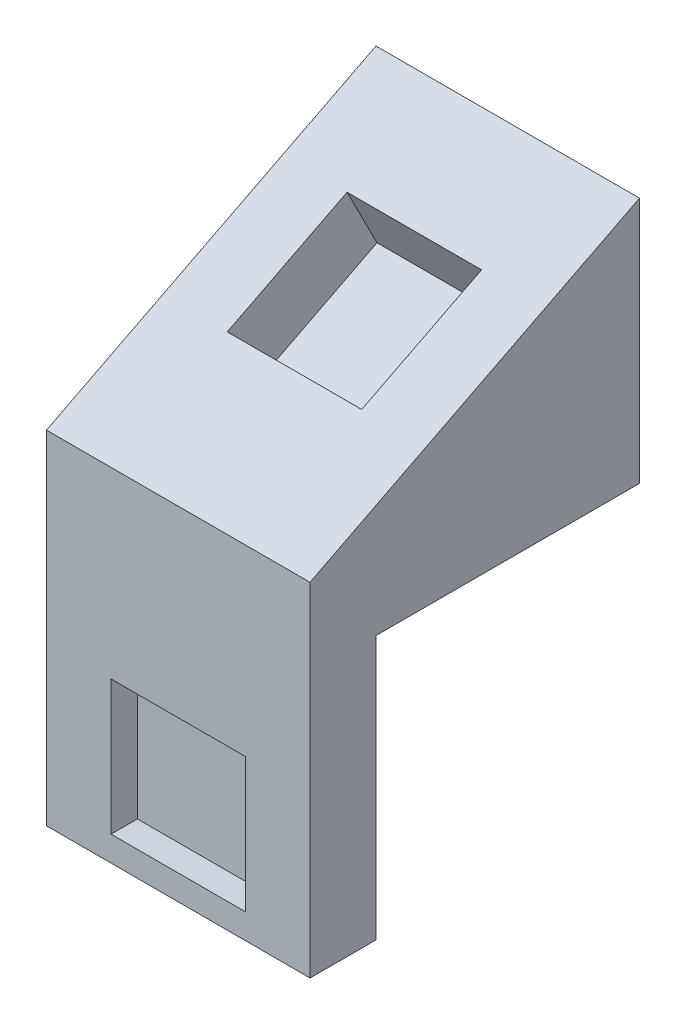
ISO-10303-21;
HEADER;
FILE_DESCRIPTION(('STEP AP214'),'2;1');
FILE_NAME('part.step','',(''),(''),'','','');
FILE_SCHEMA(('AUTOMOTIVE_DESIGN { 1 0 10303 214 1 1 1 1 }'));
ENDSEC;
DATA;
#1=APPLICATION_CONTEXT('core data for automotive mechanical design processes');
#2=APPLICATION_PROTOCOL_DEFINITION('international standard','automotive_design',2000,#1);
#3=PRODUCT_CONTEXT('',#1,'mechanical');
#4=PRODUCT('Part','Part','',(#3));
#5=PRODUCT_RELATED_PRODUCT_CATEGORY('part','',(#4));
#6=PRODUCT_DEFINITION_FORMATION('','',#4);
#7=PRODUCT_DEFINITION_CONTEXT('part definition',#1,'design');
#8=PRODUCT_DEFINITION('design','',#6,#7);
#9=PRODUCT_DEFINITION_SHAPE('','',#8);
#10=(LENGTH_UNIT() NAMED_UNIT(*) SI_UNIT(.MILLI.,.METRE.));
#11=(NAMED_UNIT(*) PLANE_ANGLE_UNIT() SI_UNIT($,.RADIAN.));
#12=(NAMED_UNIT(*) SI_UNIT($,.STERADIAN.) SOLID_ANGLE_UNIT());
#13=UNCERTAINTY_MEASURE_WITH_UNIT(LENGTH_MEASURE(1.E-05),#10,'distance_accuracy_value','');
#14=(GEOMETRIC_REPRESENTATION_CONTEXT(3) GLOBAL_UNCERTAINTY_ASSIGNED_CONTEXT((#13)) GLOBAL_UNIT_ASSIGNED_CONTEXT((#10,
#11,#12)) REPRESENTATION_CONTEXT('',''));
#15=CARTESIAN_POINT('',(0.,0.,0.));
#16=DIRECTION('',(0.,0.,1.));
#17=DIRECTION('',(1.,0.,0.));
#18=AXIS2_PLACEMENT_3D('',#15,#16,#17);
#19=CARTESIAN_POINT('',(10.,-13.,5.));
#20=DIRECTION('',(-1.,0.,0.));
#21=DIRECTION('',(0.,-1.,0.));
#22=AXIS2_PLACEMENT_3D('',#19,#20,#21);
#23=PLANE('',#22);
#24=DIRECTION('',(0.,1.,0.));
#25=VECTOR('',#24,1.);
#26=CARTESIAN_POINT('',(10.,-13.,0.));
#27=LINE('',#26,#25);
#28=CARTESIAN_POINT('',(10.,-13.,0.));
#29=VERTEX_POINT('',#28);
#30=CARTESIAN_POINT('',(10.,7.,0.));
#31=VERTEX_POINT('',#30);
#32=EDGE_CURVE('E238',#29,#31,#27,.T.);
#33=ORIENTED_EDGE('',*,*,#32,.T.);
#34=DIRECTION('',(0.,0.,1.));
#35=VECTOR('',#34,1.);
#36=CARTESIAN_POINT('',(10.,7.,-20.));
#37=LINE('',#36,#35);
#38=CARTESIAN_POINT('',(10.,7.,-20.));
#39=VERTEX_POINT('',#38);
#40=EDGE_CURVE('E235',#39,#31,#37,.T.);
#41=ORIENTED_EDGE('',*,*,#40,.F.);
#42=DIRECTION('',(0.,-1.,0.));
#43=VECTOR('',#42,1.);
#44=CARTESIAN_POINT('',(10.,13.,-20.));
#45=LINE('',#44,#43);
#46=CARTESIAN_POINT('',(10.,25.7381362373605,-20.));
#47=VERTEX_POINT('',#46);
#48=EDGE_CURVE('E226',#47,#39,#45,.T.);
#49=ORIENTED_EDGE('',*,*,#48,.F.);
#50=DIRECTION('',(0.,-0.453990499739542,0.89100652418837));
#51=VECTOR('',#50,1.);
#52=CARTESIAN_POINT('',(10.,13.,5.));
#53=LINE('',#52,#51);
#54=CARTESIAN_POINT('',(10.,13.,5.));
#55=VERTEX_POINT('',#54);
#56=EDGE_CURVE('E181',#47,#55,#53,.T.);
#57=ORIENTED_EDGE('',*,*,#56,.T.);
#58=DIRECTION('',(0.,1.,0.));
#59=VECTOR('',#58,1.);
#60=CARTESIAN_POINT('',(10.,-13.,5.));
#61=LINE('',#60,#59);
#62=CARTESIAN_POINT('',(10.,-13.,5.));
#63=VERTEX_POINT('',#62);
#64=EDGE_CURVE('E239',#63,#55,#61,.T.);
#65=ORIENTED_EDGE('',*,*,#64,.F.);
#66=DIRECTION('',(0.,0.,-1.));
#67=VECTOR('',#66,1.);
#68=CARTESIAN_POINT('',(10.,-13.,5.));
#69=LINE('',#68,#67);
#70=EDGE_CURVE('E49',#63,#29,#69,.T.);
#71=ORIENTED_EDGE('',*,*,#70,.T.);
#72=EDGE_LOOP('',(#33,#41,#49,#57,#65,#71));
#73=FACE_BOUND('',#72,.T.);
#74=ADVANCED_FACE('F42',(#73),#23,.F.);
#75=CARTESIAN_POINT('',(-10.,-13.,5.));
#76=DIRECTION('',(1.,0.,0.));
#77=DIRECTION('',(0.,1.,0.));
#78=AXIS2_PLACEMENT_3D('',#75,#76,#77);
#79=PLANE('',#78);
#80=DIRECTION('',(0.,-1.,0.));
#81=VECTOR('',#80,1.);
#82=CARTESIAN_POINT('',(-10.,-13.,5.));
#83=LINE('',#82,#81);
#84=CARTESIAN_POINT('',(-10.,13.,5.));
#85=VERTEX_POINT('',#84);
#86=CARTESIAN_POINT('',(-10.,-13.,5.));
#87=VERTEX_POINT('',#86);
#88=EDGE_CURVE('E246',#85,#87,#83,.T.);
#89=ORIENTED_EDGE('',*,*,#88,.F.);
#90=DIRECTION('',(0.,0.453990499739542,-0.891006524188371));
#91=VECTOR('',#90,1.);
#92=CARTESIAN_POINT('',(-10.,13.,5.));
#93=LINE('',#92,#91);
#94=CARTESIAN_POINT('',(-10.,25.7381362373605,-20.));
#95=VERTEX_POINT('',#94);
#96=EDGE_CURVE('E185',#85,#95,#93,.T.);
#97=ORIENTED_EDGE('',*,*,#96,.T.);
#98=DIRECTION('',(0.,1.,0.));
#99=VECTOR('',#98,1.);
#100=CARTESIAN_POINT('',(-10.,13.,-20.));
#101=LINE('',#100,#99);
#102=CARTESIAN_POINT('',(-10.,7.,-20.));
#103=VERTEX_POINT('',#102);
#104=EDGE_CURVE('E224',#103,#95,#101,.T.);
#105=ORIENTED_EDGE('',*,*,#104,.F.);
#106=DIRECTION('',(0.,0.,1.));
#107=VECTOR('',#106,1.);
#108=CARTESIAN_POINT('',(-10.,7.,-20.));
#109=LINE('',#108,#107);
#110=CARTESIAN_POINT('',(-10.,7.,0.));
#111=VERTEX_POINT('',#110);
#112=EDGE_CURVE('E230',#103,#111,#109,.T.);
#113=ORIENTED_EDGE('',*,*,#112,.T.);
#114=DIRECTION('',(0.,-1.,0.));
#115=VECTOR('',#114,1.);
#116=CARTESIAN_POINT('',(-10.,-13.,0.));
#117=LINE('',#116,#115);
#118=CARTESIAN_POINT('',(-10.,-13.,0.));
#119=VERTEX_POINT('',#118);
#120=EDGE_CURVE('E252',#111,#119,#117,.T.);
#121=ORIENTED_EDGE('',*,*,#120,.T.);
#122=DIRECTION('',(0.,0.,-1.));
#123=VECTOR('',#122,1.);
#124=CARTESIAN_POINT('',(-10.,-13.,5.));
#125=LINE('',#124,#123);
#126=EDGE_CURVE('E11',#87,#119,#125,.T.);
#127=ORIENTED_EDGE('',*,*,#126,.F.);
#128=EDGE_LOOP('',(#89,#97,#105,#113,#121,#127));
#129=FACE_BOUND('',#128,.T.);
#130=ADVANCED_FACE('F272',(#129),#79,.F.);
#131=CARTESIAN_POINT('',(-10.,-13.,5.));
#132=DIRECTION('',(0.,1.,0.));
#133=DIRECTION('',(-1.,0.,0.));
#134=AXIS2_PLACEMENT_3D('',#131,#132,#133);
#135=PLANE('',#134);
#136=DIRECTION('',(1.,0.,0.));
#137=VECTOR('',#136,1.);
#138=CARTESIAN_POINT('',(-10.,-13.,0.));
#139=LINE('',#138,#137);
#140=EDGE_CURVE('E243',#119,#29,#139,.T.);
#141=ORIENTED_EDGE('',*,*,#140,.T.);
#142=ORIENTED_EDGE('',*,*,#70,.F.);
#143=DIRECTION('',(1.,0.,0.));
#144=VECTOR('',#143,1.);
#145=CARTESIAN_POINT('',(-10.,-13.,5.));
#146=LINE('',#145,#144);
#147=EDGE_CURVE('E248',#87,#63,#146,.T.);
#148=ORIENTED_EDGE('',*,*,#147,.F.);
#149=ORIENTED_EDGE('',*,*,#126,.T.);
#150=EDGE_LOOP('',(#141,#142,#148,#149));
#151=FACE_BOUND('',#150,.T.);
#152=ADVANCED_FACE('F281',(#151),#135,.F.);
#153=CARTESIAN_POINT('',(0.,0.,5.));
#154=DIRECTION('',(0.,0.,-1.));
#155=DIRECTION('',(-1.,0.,0.));
#156=AXIS2_PLACEMENT_3D('',#153,#154,#155);
#157=PLANE('',#156);
#158=DIRECTION('',(-1.,0.,0.));
#159=VECTOR('',#158,1.);
#160=CARTESIAN_POINT('',(-5.1,-0.900000000000004,5.));
#161=LINE('',#160,#159);
#162=CARTESIAN_POINT('',(5.1,-0.900000000000004,5.));
#163=VERTEX_POINT('',#162);
#164=CARTESIAN_POINT('',(-5.1,-0.900000000000004,5.));
#165=VERTEX_POINT('',#164);
#166=EDGE_CURVE('E208',#163,#165,#161,.T.);
#167=ORIENTED_EDGE('',*,*,#166,.F.);
#168=DIRECTION('',(0.,1.,0.));
#169=VECTOR('',#168,1.);
#170=CARTESIAN_POINT('',(5.1,-11.1,5.));
#171=LINE('',#170,#169);
#172=CARTESIAN_POINT('',(5.1,-11.1,5.));
#173=VERTEX_POINT('',#172);
#174=EDGE_CURVE('E64',#173,#163,#171,.T.);
#175=ORIENTED_EDGE('',*,*,#174,.F.);
#176=DIRECTION('',(1.,0.,0.));
#177=VECTOR('',#176,1.);
#178=CARTESIAN_POINT('',(-5.1,-11.1,5.));
#179=LINE('',#178,#177);
#180=CARTESIAN_POINT('',(-5.1,-11.1,5.));
#181=VERTEX_POINT('',#180);
#182=EDGE_CURVE('E197',#181,#173,#179,.T.);
#183=ORIENTED_EDGE('',*,*,#182,.F.);
#184=DIRECTION('',(0.,-1.,0.));
#185=VECTOR('',#184,1.);
#186=CARTESIAN_POINT('',(-5.1,-11.1,5.));
#187=LINE('',#186,#185);
#188=EDGE_CURVE('E211',#165,#181,#187,.T.);
#189=ORIENTED_EDGE('',*,*,#188,.F.);
#190=EDGE_LOOP('',(#167,#175,#183,#189));
#191=FACE_BOUND('',#190,.T.);
#192=ORIENTED_EDGE('',*,*,#64,.T.);
#193=DIRECTION('',(-1.,0.,0.));
#194=VECTOR('',#193,1.);
#195=CARTESIAN_POINT('',(-10.,13.,5.));
#196=LINE('',#195,#194);
#197=EDGE_CURVE('E242',#55,#85,#196,.T.);
#198=ORIENTED_EDGE('',*,*,#197,.T.);
#199=ORIENTED_EDGE('',*,*,#88,.T.);
#200=ORIENTED_EDGE('',*,*,#147,.T.);
#201=EDGE_LOOP('',(#192,#198,#199,#200));
#202=FACE_BOUND('',#201,.T.);
#203=ADVANCED_FACE('F280',(#191,#202),#157,.F.);
#204=CARTESIAN_POINT('',(0.,0.,0.));
#205=DIRECTION('',(0.,0.,-1.));
#206=DIRECTION('',(-1.,0.,0.));
#207=AXIS2_PLACEMENT_3D('',#204,#205,#206);
#208=PLANE('',#207);
#209=DIRECTION('',(-1.,0.,0.));
#210=VECTOR('',#209,1.);
#211=CARTESIAN_POINT('',(-10.,7.,0.));
#212=LINE('',#211,#210);
#213=EDGE_CURVE('E218',#31,#111,#212,.T.);
#214=ORIENTED_EDGE('',*,*,#213,.F.);
#215=ORIENTED_EDGE('',*,*,#32,.F.);
#216=ORIENTED_EDGE('',*,*,#140,.F.);
#217=ORIENTED_EDGE('',*,*,#120,.F.);
#218=EDGE_LOOP('',(#214,#215,#216,#217));
#219=FACE_BOUND('',#218,.T.);
#220=ADVANCED_FACE('F264',(#219),#208,.T.);
#221=CARTESIAN_POINT('',(-10.,7.,-20.));
#222=DIRECTION('',(0.,1.,0.));
#223=DIRECTION('',(0.,0.,1.));
#224=AXIS2_PLACEMENT_3D('',#221,#222,#223);
#225=PLANE('',#224);
#226=ORIENTED_EDGE('',*,*,#213,.T.);
#227=ORIENTED_EDGE('',*,*,#112,.F.);
#228=DIRECTION('',(-1.,0.,0.));
#229=VECTOR('',#228,1.);
#230=CARTESIAN_POINT('',(-10.,7.,-20.));
#231=LINE('',#230,#229);
#232=EDGE_CURVE('E228',#39,#103,#231,.T.);
#233=ORIENTED_EDGE('',*,*,#232,.F.);
#234=ORIENTED_EDGE('',*,*,#40,.T.);
#235=EDGE_LOOP('',(#226,#227,#233,#234));
#236=FACE_BOUND('',#235,.T.);
#237=ADVANCED_FACE('F267',(#236),#225,.F.);
#238=CARTESIAN_POINT('',(0.,0.,-20.));
#239=DIRECTION('',(0.,0.,1.));
#240=DIRECTION('',(1.,0.,0.));
#241=AXIS2_PLACEMENT_3D('',#238,#239,#240);
#242=PLANE('',#241);
#243=CARTESIAN_POINT('',(0.,13.,-20.));
#244=DIRECTION('',(0.,0.,-1.));
#245=DIRECTION('',(-1.,0.,0.));
#246=AXIS2_PLACEMENT_3D('',#243,#244,#245);
#247=CIRCLE('',#246,2.);
#248=CARTESIAN_POINT('',(-2.,13.,-20.));
#249=VERTEX_POINT('',#248);
#250=EDGE_CURVE('E168',#249,#249,#247,.T.);
#251=ORIENTED_EDGE('',*,*,#250,.F.);
#252=EDGE_LOOP('',(#251));
#253=FACE_BOUND('',#252,.T.);
#254=ORIENTED_EDGE('',*,*,#104,.T.);
#255=DIRECTION('',(1.,0.,0.));
#256=VECTOR('',#255,1.);
#257=CARTESIAN_POINT('',(-38.058155940859,25.7381362373605,-20.));
#258=LINE('',#257,#256);
#259=EDGE_CURVE('E188',#95,#47,#258,.T.);
#260=ORIENTED_EDGE('',*,*,#259,.T.);
#261=ORIENTED_EDGE('',*,*,#48,.T.);
#262=ORIENTED_EDGE('',*,*,#232,.T.);
#263=EDGE_LOOP('',(#254,#260,#261,#262));
#264=FACE_BOUND('',#263,.T.);
#265=ADVANCED_FACE('F276',(#253,#264),#242,.F.);
#266=CARTESIAN_POINT('',(5.1,-11.1,3.));
#267=DIRECTION('',(1.,0.,0.));
#268=DIRECTION('',(0.,1.,0.));
#269=AXIS2_PLACEMENT_3D('',#266,#267,#268);
#270=PLANE('',#269);
#271=ORIENTED_EDGE('',*,*,#174,.T.);
#272=DIRECTION('',(0.,0.,1.));
#273=VECTOR('',#272,1.);
#274=CARTESIAN_POINT('',(5.1,-0.900000000000004,3.));
#275=LINE('',#274,#273);
#276=CARTESIAN_POINT('',(5.1,-0.900000000000004,3.));
#277=VERTEX_POINT('',#276);
#278=EDGE_CURVE('E206',#277,#163,#275,.T.);
#279=ORIENTED_EDGE('',*,*,#278,.F.);
#280=DIRECTION('',(0.,1.,0.));
#281=VECTOR('',#280,1.);
#282=CARTESIAN_POINT('',(5.1,-11.1,3.));
#283=LINE('',#282,#281);
#284=CARTESIAN_POINT('',(5.1,-11.1,3.));
#285=VERTEX_POINT('',#284);
#286=EDGE_CURVE('E193',#285,#277,#283,.T.);
#287=ORIENTED_EDGE('',*,*,#286,.F.);
#288=DIRECTION('',(0.,0.,1.));
#289=VECTOR('',#288,1.);
#290=CARTESIAN_POINT('',(5.1,-11.1,3.));
#291=LINE('',#290,#289);
#292=EDGE_CURVE('E216',#285,#173,#291,.T.);
#293=ORIENTED_EDGE('',*,*,#292,.T.);
#294=EDGE_LOOP('',(#271,#279,#287,#293));
#295=FACE_BOUND('',#294,.T.);
#296=ADVANCED_FACE('F368',(#295),#270,.F.);
#297=CARTESIAN_POINT('',(-5.1,-11.1,3.));
#298=DIRECTION('',(0.,-1.,0.));
#299=DIRECTION('',(0.,0.,-1.));
#300=AXIS2_PLACEMENT_3D('',#297,#298,#299);
#301=PLANE('',#300);
#302=ORIENTED_EDGE('',*,*,#182,.T.);
#303=ORIENTED_EDGE('',*,*,#292,.F.);
#304=DIRECTION('',(1.,0.,0.));
#305=VECTOR('',#304,1.);
#306=CARTESIAN_POINT('',(-5.1,-11.1,3.));
#307=LINE('',#306,#305);
#308=CARTESIAN_POINT('',(-5.1,-11.1,3.));
#309=VERTEX_POINT('',#308);
#310=EDGE_CURVE('E203',#309,#285,#307,.T.);
#311=ORIENTED_EDGE('',*,*,#310,.F.);
#312=DIRECTION('',(0.,0.,1.));
#313=VECTOR('',#312,1.);
#314=CARTESIAN_POINT('',(-5.1,-11.1,3.));
#315=LINE('',#314,#313);
#316=EDGE_CURVE('E219',#309,#181,#315,.T.);
#317=ORIENTED_EDGE('',*,*,#316,.T.);
#318=EDGE_LOOP('',(#302,#303,#311,#317));
#319=FACE_BOUND('',#318,.T.);
#320=ADVANCED_FACE('F417',(#319),#301,.F.);
#321=CARTESIAN_POINT('',(-5.1,-11.1,3.));
#322=DIRECTION('',(-1.,0.,0.));
#323=DIRECTION('',(0.,-1.,0.));
#324=AXIS2_PLACEMENT_3D('',#321,#322,#323);
#325=PLANE('',#324);
#326=ORIENTED_EDGE('',*,*,#188,.T.);
#327=ORIENTED_EDGE('',*,*,#316,.F.);
#328=DIRECTION('',(0.,-1.,0.));
#329=VECTOR('',#328,1.);
#330=CARTESIAN_POINT('',(-5.1,-11.1,3.));
#331=LINE('',#330,#329);
#332=CARTESIAN_POINT('',(-5.1,-0.900000000000004,3.));
#333=VERTEX_POINT('',#332);
#334=EDGE_CURVE('E200',#333,#309,#331,.T.);
#335=ORIENTED_EDGE('',*,*,#334,.F.);
#336=DIRECTION('',(0.,0.,1.));
#337=VECTOR('',#336,1.);
#338=CARTESIAN_POINT('',(-5.1,-0.900000000000004,3.));
#339=LINE('',#338,#337);
#340=EDGE_CURVE('E221',#333,#165,#339,.T.);
#341=ORIENTED_EDGE('',*,*,#340,.T.);
#342=EDGE_LOOP('',(#326,#327,#335,#341));
#343=FACE_BOUND('',#342,.T.);
#344=ADVANCED_FACE('F408',(#343),#325,.F.);
#345=CARTESIAN_POINT('',(-5.1,-0.900000000000004,3.));
#346=DIRECTION('',(0.,1.,0.));
#347=DIRECTION('',(0.,0.,1.));
#348=AXIS2_PLACEMENT_3D('',#345,#346,#347);
#349=PLANE('',#348);
#350=ORIENTED_EDGE('',*,*,#166,.T.);
#351=ORIENTED_EDGE('',*,*,#340,.F.);
#352=DIRECTION('',(-1.,0.,0.));
#353=VECTOR('',#352,1.);
#354=CARTESIAN_POINT('',(-5.1,-0.900000000000004,3.));
#355=LINE('',#354,#353);
#356=EDGE_CURVE('E196',#277,#333,#355,.T.);
#357=ORIENTED_EDGE('',*,*,#356,.F.);
#358=ORIENTED_EDGE('',*,*,#278,.T.);
#359=EDGE_LOOP('',(#350,#351,#357,#358));
#360=FACE_BOUND('',#359,.T.);
#361=ADVANCED_FACE('F400',(#360),#349,.F.);
#362=CARTESIAN_POINT('',(0.,0.,3.));
#363=DIRECTION('',(0.,0.,-1.));
#364=DIRECTION('',(-1.,0.,0.));
#365=AXIS2_PLACEMENT_3D('',#362,#363,#364);
#366=PLANE('',#365);
#367=ORIENTED_EDGE('',*,*,#286,.T.);
#368=ORIENTED_EDGE('',*,*,#356,.T.);
#369=ORIENTED_EDGE('',*,*,#334,.T.);
#370=ORIENTED_EDGE('',*,*,#310,.T.);
#371=EDGE_LOOP('',(#367,#368,#369,#370));
#372=FACE_BOUND('',#371,.T.);
#373=ADVANCED_FACE('F301',(#372),#366,.F.);
#374=CARTESIAN_POINT('',(-38.058155940859,13.,5.));
#375=DIRECTION('',(0.,0.891006524188371,0.453990499739542));
#376=DIRECTION('',(0.,-0.453990499739542,0.891006524188371));
#377=AXIS2_PLACEMENT_3D('',#374,#375,#376);
#378=PLANE('',#377);
#379=DIRECTION('',(0.,0.453990499739542,-0.89100652418837));
#380=VECTOR('',#379,1.);
#381=CARTESIAN_POINT('',(5.1,17.4945059474215,-3.82096458946487));
#382=LINE('',#381,#380);
#383=CARTESIAN_POINT('',(5.1,17.4945059474215,-3.82096458946487));
#384=VERTEX_POINT('',#383);
#385=CARTESIAN_POINT('',(5.1,22.1252090447648,-12.9092311361862));
#386=VERTEX_POINT('',#385);
#387=EDGE_CURVE('E56',#384,#386,#382,.T.);
#388=ORIENTED_EDGE('',*,*,#387,.F.);
#389=DIRECTION('',(1.,0.,0.));
#390=VECTOR('',#389,1.);
#391=CARTESIAN_POINT('',(-5.1,17.4945059474215,-3.82096458946487));
#392=LINE('',#391,#390);
#393=CARTESIAN_POINT('',(-5.1,17.4945059474215,-3.82096458946487));
#394=VERTEX_POINT('',#393);
#395=EDGE_CURVE('E162',#394,#384,#392,.T.);
#396=ORIENTED_EDGE('',*,*,#395,.F.);
#397=DIRECTION('',(0.,-0.453990499739541,0.891006524188371));
#398=VECTOR('',#397,1.);
#399=CARTESIAN_POINT('',(-5.1,17.4945059474215,-3.82096458946487));
#400=LINE('',#399,#398);
#401=CARTESIAN_POINT('',(-5.1,22.1252090447648,-12.9092311361862));
#402=VERTEX_POINT('',#401);
#403=EDGE_CURVE('E165',#402,#394,#400,.T.);
#404=ORIENTED_EDGE('',*,*,#403,.F.);
#405=DIRECTION('',(-1.,0.,0.));
#406=VECTOR('',#405,1.);
#407=CARTESIAN_POINT('',(-5.1,22.1252090447648,-12.9092311361862));
#408=LINE('',#407,#406);
#409=EDGE_CURVE('E174',#386,#402,#408,.T.);
#410=ORIENTED_EDGE('',*,*,#409,.F.);
#411=EDGE_LOOP('',(#388,#396,#404,#410));
#412=FACE_BOUND('',#411,.T.);
#413=ORIENTED_EDGE('',*,*,#96,.F.);
#414=ORIENTED_EDGE('',*,*,#197,.F.);
#415=ORIENTED_EDGE('',*,*,#56,.F.);
#416=ORIENTED_EDGE('',*,*,#259,.F.);
#417=EDGE_LOOP('',(#413,#414,#415,#416));
#418=FACE_BOUND('',#417,.T.);
#419=ADVANCED_FACE('F316',(#412,#418),#378,.T.);
#420=CARTESIAN_POINT('',(5.1,13.0394733264796,-6.09091708816258));
#421=DIRECTION('',(1.,0.,0.));
#422=DIRECTION('',(0.,1.,0.));
#423=AXIS2_PLACEMENT_3D('',#420,#421,#422);
#424=PLANE('',#423);
#425=ORIENTED_EDGE('',*,*,#387,.T.);
#426=DIRECTION('',(0.,0.891006524188371,0.453990499739542));
#427=VECTOR('',#426,1.);
#428=CARTESIAN_POINT('',(5.1,17.6701764238229,-15.179183634884));
#429=LINE('',#428,#427);
#430=CARTESIAN_POINT('',(5.1,17.6701764238229,-15.179183634884));
#431=VERTEX_POINT('',#430);
#432=EDGE_CURVE('E140',#431,#386,#429,.T.);
#433=ORIENTED_EDGE('',*,*,#432,.F.);
#434=DIRECTION('',(0.,0.453990499739542,-0.89100652418837));
#435=VECTOR('',#434,1.);
#436=CARTESIAN_POINT('',(5.1,13.0394733264796,-6.09091708816258));
#437=LINE('',#436,#435);
#438=CARTESIAN_POINT('',(5.1,13.0394733264796,-6.09091708816258));
#439=VERTEX_POINT('',#438);
#440=EDGE_CURVE('E144',#439,#431,#437,.T.);
#441=ORIENTED_EDGE('',*,*,#440,.F.);
#442=DIRECTION('',(0.,0.891006524188371,0.453990499739542));
#443=VECTOR('',#442,1.);
#444=CARTESIAN_POINT('',(5.1,13.0394733264796,-6.09091708816258));
#445=LINE('',#444,#443);
#446=EDGE_CURVE('E179',#439,#384,#445,.T.);
#447=ORIENTED_EDGE('',*,*,#446,.T.);
#448=EDGE_LOOP('',(#425,#433,#441,#447));
#449=FACE_BOUND('',#448,.T.);
#450=ADVANCED_FACE('F142',(#449),#424,.F.);
#451=CARTESIAN_POINT('',(-5.1,13.0394733264796,-6.09091708816258));
#452=DIRECTION('',(0.,-0.453990499739542,0.891006524188371));
#453=DIRECTION('',(0.,-0.891006524188371,-0.453990499739542));
#454=AXIS2_PLACEMENT_3D('',#451,#452,#453);
#455=PLANE('',#454);
#456=ORIENTED_EDGE('',*,*,#395,.T.);
#457=ORIENTED_EDGE('',*,*,#446,.F.);
#458=DIRECTION('',(1.,0.,0.));
#459=VECTOR('',#458,1.);
#460=CARTESIAN_POINT('',(-5.1,13.0394733264796,-6.09091708816258));
#461=LINE('',#460,#459);
#462=CARTESIAN_POINT('',(-5.1,13.0394733264796,-6.09091708816258));
#463=VERTEX_POINT('',#462);
#464=EDGE_CURVE('E150',#463,#439,#461,.T.);
#465=ORIENTED_EDGE('',*,*,#464,.F.);
#466=DIRECTION('',(0.,0.891006524188371,0.453990499739542));
#467=VECTOR('',#466,1.);
#468=CARTESIAN_POINT('',(-5.1,13.0394733264796,-6.09091708816258));
#469=LINE('',#468,#467);
#470=EDGE_CURVE('E182',#463,#394,#469,.T.);
#471=ORIENTED_EDGE('',*,*,#470,.T.);
#472=EDGE_LOOP('',(#456,#457,#465,#471));
#473=FACE_BOUND('',#472,.T.);
#474=ADVANCED_FACE('F328',(#473),#455,.F.);
#475=CARTESIAN_POINT('',(-5.1,13.0394733264796,-6.09091708816258));
#476=DIRECTION('',(-1.,0.,0.));
#477=DIRECTION('',(0.,-1.,0.));
#478=AXIS2_PLACEMENT_3D('',#475,#476,#477);
#479=PLANE('',#478);
#480=ORIENTED_EDGE('',*,*,#403,.T.);
#481=ORIENTED_EDGE('',*,*,#470,.F.);
#482=DIRECTION('',(0.,-0.453990499739541,0.891006524188371));
#483=VECTOR('',#482,1.);
#484=CARTESIAN_POINT('',(-5.1,13.0394733264796,-6.09091708816258));
#485=LINE('',#484,#483);
#486=CARTESIAN_POINT('',(-5.1,17.6701764238229,-15.179183634884));
#487=VERTEX_POINT('',#486);
#488=EDGE_CURVE('E158',#487,#463,#485,.T.);
#489=ORIENTED_EDGE('',*,*,#488,.F.);
#490=DIRECTION('',(0.,0.891006524188371,0.453990499739542));
#491=VECTOR('',#490,1.);
#492=CARTESIAN_POINT('',(-5.1,17.6701764238229,-15.179183634884));
#493=LINE('',#492,#491);
#494=EDGE_CURVE('E149',#487,#402,#493,.T.);
#495=ORIENTED_EDGE('',*,*,#494,.T.);
#496=EDGE_LOOP('',(#480,#481,#489,#495));
#497=FACE_BOUND('',#496,.T.);
#498=ADVANCED_FACE('F336',(#497),#479,.F.);
#499=CARTESIAN_POINT('',(-5.1,17.6701764238229,-15.179183634884));
#500=DIRECTION('',(0.,0.453990499739542,-0.891006524188371));
#501=DIRECTION('',(0.,0.891006524188371,0.453990499739542));
#502=AXIS2_PLACEMENT_3D('',#499,#500,#501);
#503=PLANE('',#502);
#504=ORIENTED_EDGE('',*,*,#409,.T.);
#505=ORIENTED_EDGE('',*,*,#494,.F.);
#506=DIRECTION('',(-1.,0.,0.));
#507=VECTOR('',#506,1.);
#508=CARTESIAN_POINT('',(-5.1,17.6701764238229,-15.179183634884));
#509=LINE('',#508,#507);
#510=EDGE_CURVE('E153',#431,#487,#509,.T.);
#511=ORIENTED_EDGE('',*,*,#510,.F.);
#512=ORIENTED_EDGE('',*,*,#432,.T.);
#513=EDGE_LOOP('',(#504,#505,#511,#512));
#514=FACE_BOUND('',#513,.T.);
#515=ADVANCED_FACE('F154',(#514),#503,.F.);
#516=CARTESIAN_POINT('',(0.,7.88811400489664,4.0191948340082));
#517=DIRECTION('',(0.,-0.89100652418837,-0.453990499739542));
#518=DIRECTION('',(0.,0.453990499739542,-0.89100652418837));
#519=AXIS2_PLACEMENT_3D('',#516,#517,#518);
#520=PLANE('',#519);
#521=ORIENTED_EDGE('',*,*,#440,.T.);
#522=ORIENTED_EDGE('',*,*,#510,.T.);
#523=ORIENTED_EDGE('',*,*,#488,.T.);
#524=ORIENTED_EDGE('',*,*,#464,.T.);
#525=EDGE_LOOP('',(#521,#522,#523,#524));
#526=FACE_BOUND('',#525,.T.);
#527=ADVANCED_FACE('F160',(#526),#520,.F.);
#528=CARTESIAN_POINT('',(0.,13.,-14.));
#529=DIRECTION('',(0.,0.,-1.));
#530=DIRECTION('',(-1.,0.,0.));
#531=AXIS2_PLACEMENT_3D('',#528,#529,#530);
#532=CYLINDRICAL_SURFACE('',#531,2.);
#533=CARTESIAN_POINT('',(0.,13.,-14.));
#534=DIRECTION('',(0.,0.,-1.));
#535=DIRECTION('',(-1.,0.,0.));
#536=AXIS2_PLACEMENT_3D('',#533,#534,#535);
#537=CIRCLE('',#536,2.);
#538=CARTESIAN_POINT('',(-2.,13.,-14.));
#539=VERTEX_POINT('',#538);
#540=EDGE_CURVE('E175',#539,#539,#537,.T.);
#541=ORIENTED_EDGE('',*,*,#540,.F.);
#542=EDGE_LOOP('',(#541));
#543=FACE_BOUND('',#542,.T.);
#544=ORIENTED_EDGE('',*,*,#250,.T.);
#545=EDGE_LOOP('',(#544));
#546=FACE_BOUND('',#545,.T.);
#547=ADVANCED_FACE('F360',(#543,#546),#532,.F.);
#548=CARTESIAN_POINT('',(0.,13.,-14.));
#549=DIRECTION('',(0.,0.,-1.));
#550=DIRECTION('',(-1.,0.,0.));
#551=AXIS2_PLACEMENT_3D('',#548,#549,#550);
#552=PLANE('',#551);
#553=ORIENTED_EDGE('',*,*,#540,.T.);
#554=EDGE_LOOP('',(#553));
#555=FACE_BOUND('',#554,.T.);
#556=ADVANCED_FACE('F376',(#555),#552,.T.);
#557=CLOSED_SHELL('',(#74,#130,#152,#203,#220,#237,#265,#296,#320,#344,#361,#373,#419,#450,#474,
#498,#515,#527,#547,#556));
#558=MANIFOLD_SOLID_BREP('B2',#557);
#559=ADVANCED_BREP_SHAPE_REPRESENTATION('',(#18,#558),#14);
#560=SHAPE_DEFINITION_REPRESENTATION(#9,#559);
ENDSEC;
END-ISO-10303-21;
